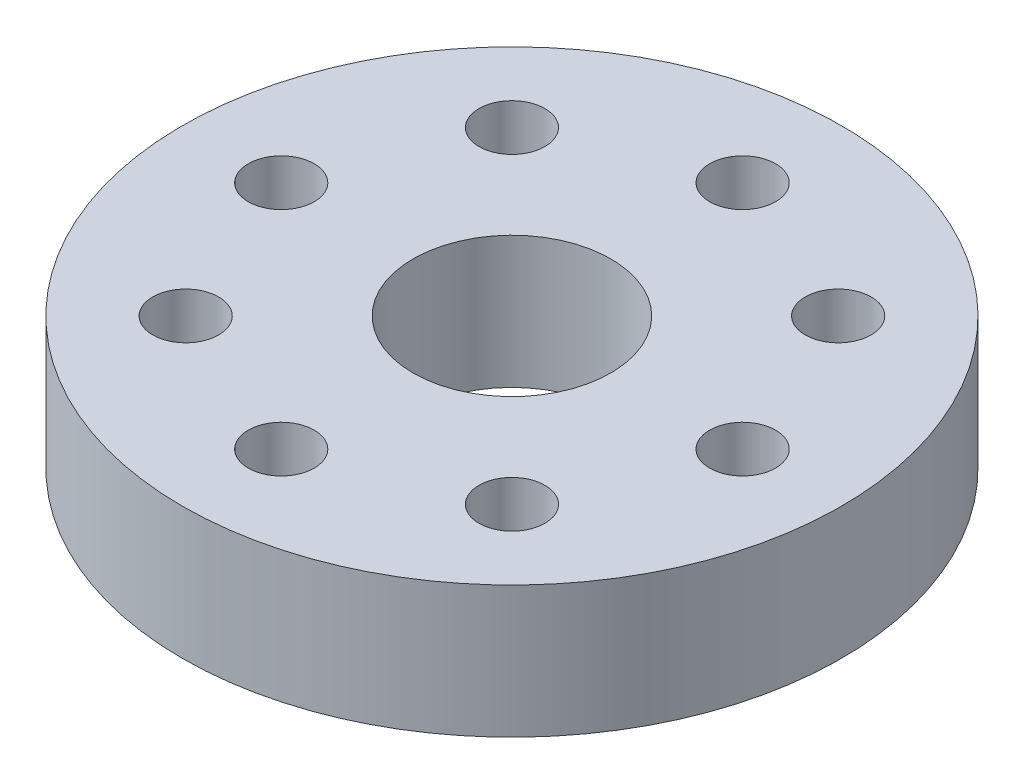
ISO-10303-21;
HEADER;
FILE_DESCRIPTION(('STEP AP214'),'2;1');
FILE_NAME('part.step','',(''),(''),'','','');
FILE_SCHEMA(('AUTOMOTIVE_DESIGN { 1 0 10303 214 1 1 1 1 }'));
ENDSEC;
DATA;
#1=APPLICATION_CONTEXT('core data for automotive mechanical design processes');
#2=APPLICATION_PROTOCOL_DEFINITION('international standard','automotive_design',2000,#1);
#3=PRODUCT_CONTEXT('',#1,'mechanical');
#4=PRODUCT('Part','Part','',(#3));
#5=PRODUCT_RELATED_PRODUCT_CATEGORY('part','',(#4));
#6=PRODUCT_DEFINITION_FORMATION('','',#4);
#7=PRODUCT_DEFINITION_CONTEXT('part definition',#1,'design');
#8=PRODUCT_DEFINITION('design','',#6,#7);
#9=PRODUCT_DEFINITION_SHAPE('','',#8);
#10=(LENGTH_UNIT() NAMED_UNIT(*) SI_UNIT(.MILLI.,.METRE.));
#11=(NAMED_UNIT(*) PLANE_ANGLE_UNIT() SI_UNIT($,.RADIAN.));
#12=(NAMED_UNIT(*) SI_UNIT($,.STERADIAN.) SOLID_ANGLE_UNIT());
#13=UNCERTAINTY_MEASURE_WITH_UNIT(LENGTH_MEASURE(1.E-05),#10,'distance_accuracy_value','');
#14=(GEOMETRIC_REPRESENTATION_CONTEXT(3) GLOBAL_UNCERTAINTY_ASSIGNED_CONTEXT((#13)) GLOBAL_UNIT_ASSIGNED_CONTEXT((#10,
#11,#12)) REPRESENTATION_CONTEXT('',''));
#15=CARTESIAN_POINT('',(0.,0.,0.));
#16=DIRECTION('',(0.,0.,1.));
#17=DIRECTION('',(1.,0.,0.));
#18=AXIS2_PLACEMENT_3D('',#15,#16,#17);
#19=CARTESIAN_POINT('',(0.,4.,0.));
#20=DIRECTION('',(0.,1.,0.));
#21=DIRECTION('',(0.,0.,1.));
#22=AXIS2_PLACEMENT_3D('',#19,#20,#21);
#23=PLANE('',#22);
#24=CARTESIAN_POINT('',(-7.,4.,0.));
#25=DIRECTION('',(0.,1.,0.));
#26=DIRECTION('',(0.,0.,1.));
#27=AXIS2_PLACEMENT_3D('',#24,#25,#26);
#28=CIRCLE('',#27,1.00000000000039);
#29=CARTESIAN_POINT('',(-7.,4.,1.0000000000004));
#30=VERTEX_POINT('',#29);
#31=EDGE_CURVE('E86',#30,#30,#28,.T.);
#32=ORIENTED_EDGE('',*,*,#31,.F.);
#33=EDGE_LOOP('',(#32));
#34=FACE_BOUND('',#33,.T.);
#35=CARTESIAN_POINT('',(0.,4.,7.));
#36=DIRECTION('',(0.,1.,0.));
#37=DIRECTION('',(0.,0.,1.));
#38=AXIS2_PLACEMENT_3D('',#35,#36,#37);
#39=CIRCLE('',#38,1.00000000000114);
#40=CARTESIAN_POINT('',(0.,4.,8.00000000000114));
#41=VERTEX_POINT('',#40);
#42=EDGE_CURVE('E74',#41,#41,#39,.T.);
#43=ORIENTED_EDGE('',*,*,#42,.F.);
#44=EDGE_LOOP('',(#43));
#45=FACE_BOUND('',#44,.T.);
#46=CARTESIAN_POINT('',(7.,4.,0.));
#47=DIRECTION('',(0.,1.,0.));
#48=DIRECTION('',(0.,0.,1.));
#49=AXIS2_PLACEMENT_3D('',#46,#47,#48);
#50=CIRCLE('',#49,1.00000000000074);
#51=CARTESIAN_POINT('',(7.,4.,1.00000000000074));
#52=VERTEX_POINT('',#51);
#53=EDGE_CURVE('E62',#52,#52,#50,.T.);
#54=ORIENTED_EDGE('',*,*,#53,.F.);
#55=EDGE_LOOP('',(#54));
#56=FACE_BOUND('',#55,.T.);
#57=CARTESIAN_POINT('',(0.,4.,-7.));
#58=DIRECTION('',(0.,1.,0.));
#59=DIRECTION('',(0.,0.,1.));
#60=AXIS2_PLACEMENT_3D('',#57,#58,#59);
#61=CIRCLE('',#60,1.);
#62=CARTESIAN_POINT('',(0.,4.,-6.));
#63=VERTEX_POINT('',#62);
#64=EDGE_CURVE('E50',#63,#63,#61,.T.);
#65=ORIENTED_EDGE('',*,*,#64,.F.);
#66=EDGE_LOOP('',(#65));
#67=FACE_BOUND('',#66,.T.);
#68=CARTESIAN_POINT('',(0.,4.,0.));
#69=DIRECTION('',(0.,1.,0.));
#70=DIRECTION('',(0.,0.,1.));
#71=AXIS2_PLACEMENT_3D('',#68,#69,#70);
#72=CIRCLE('',#71,10.);
#73=CARTESIAN_POINT('',(0.,4.,10.));
#74=VERTEX_POINT('',#73);
#75=EDGE_CURVE('E10',#74,#74,#72,.T.);
#76=ORIENTED_EDGE('',*,*,#75,.T.);
#77=EDGE_LOOP('',(#76));
#78=FACE_BOUND('',#77,.T.);
#79=CARTESIAN_POINT('',(0.,4.,0.));
#80=DIRECTION('',(0.,1.,0.));
#81=DIRECTION('',(0.,0.,1.));
#82=AXIS2_PLACEMENT_3D('',#79,#80,#81);
#83=CIRCLE('',#82,3.);
#84=CARTESIAN_POINT('',(0.,4.,3.));
#85=VERTEX_POINT('',#84);
#86=EDGE_CURVE('E45',#85,#85,#83,.T.);
#87=ORIENTED_EDGE('',*,*,#86,.F.);
#88=EDGE_LOOP('',(#87));
#89=FACE_BOUND('',#88,.T.);
#90=CARTESIAN_POINT('',(4.94974746830583,4.,-4.94974746830583));
#91=DIRECTION('',(0.,1.,0.));
#92=DIRECTION('',(0.,0.,1.));
#93=AXIS2_PLACEMENT_3D('',#90,#91,#92);
#94=CIRCLE('',#93,1.00000000000029);
#95=CARTESIAN_POINT('',(4.94974746830583,4.,-3.94974746830554));
#96=VERTEX_POINT('',#95);
#97=EDGE_CURVE('E56',#96,#96,#94,.T.);
#98=ORIENTED_EDGE('',*,*,#97,.F.);
#99=EDGE_LOOP('',(#98));
#100=FACE_BOUND('',#99,.T.);
#101=CARTESIAN_POINT('',(4.94974746830583,4.,4.94974746830583));
#102=DIRECTION('',(0.,1.,0.));
#103=DIRECTION('',(0.,0.,1.));
#104=AXIS2_PLACEMENT_3D('',#101,#102,#103);
#105=CIRCLE('',#104,1.0000000000011);
#106=CARTESIAN_POINT('',(4.94974746830583,4.,5.94974746830693));
#107=VERTEX_POINT('',#106);
#108=EDGE_CURVE('E68',#107,#107,#105,.T.);
#109=ORIENTED_EDGE('',*,*,#108,.F.);
#110=EDGE_LOOP('',(#109));
#111=FACE_BOUND('',#110,.T.);
#112=CARTESIAN_POINT('',(-4.94974746830583,4.,4.94974746830583));
#113=DIRECTION('',(0.,1.,0.));
#114=DIRECTION('',(0.,0.,1.));
#115=AXIS2_PLACEMENT_3D('',#112,#113,#114);
#116=CIRCLE('',#115,1.00000000000085);
#117=CARTESIAN_POINT('',(-4.94974746830583,4.,5.94974746830668));
#118=VERTEX_POINT('',#117);
#119=EDGE_CURVE('E80',#118,#118,#116,.T.);
#120=ORIENTED_EDGE('',*,*,#119,.F.);
#121=EDGE_LOOP('',(#120));
#122=FACE_BOUND('',#121,.T.);
#123=CARTESIAN_POINT('',(-4.94974746830583,4.,-4.94974746830583));
#124=DIRECTION('',(0.,1.,0.));
#125=DIRECTION('',(0.,0.,1.));
#126=AXIS2_PLACEMENT_3D('',#123,#124,#125);
#127=CIRCLE('',#126,1.00000000000004);
#128=CARTESIAN_POINT('',(-4.94974746830583,4.,-3.94974746830579));
#129=VERTEX_POINT('',#128);
#130=EDGE_CURVE('E92',#129,#129,#127,.T.);
#131=ORIENTED_EDGE('',*,*,#130,.F.);
#132=EDGE_LOOP('',(#131));
#133=FACE_BOUND('',#132,.T.);
#134=ADVANCED_FACE('F34',(#34,#45,#56,#67,#78,#89,#100,#111,#122,#133),#23,.T.);
#135=CARTESIAN_POINT('',(0.,0.,0.));
#136=DIRECTION('',(0.,1.,0.));
#137=DIRECTION('',(0.,0.,1.));
#138=AXIS2_PLACEMENT_3D('',#135,#136,#137);
#139=PLANE('',#138);
#140=CARTESIAN_POINT('',(0.,0.,0.));
#141=DIRECTION('',(0.,1.,0.));
#142=DIRECTION('',(0.,0.,1.));
#143=AXIS2_PLACEMENT_3D('',#140,#141,#142);
#144=CIRCLE('',#143,10.);
#145=CARTESIAN_POINT('',(0.,0.,10.));
#146=VERTEX_POINT('',#145);
#147=EDGE_CURVE('E38',#146,#146,#144,.T.);
#148=ORIENTED_EDGE('',*,*,#147,.F.);
#149=EDGE_LOOP('',(#148));
#150=FACE_BOUND('',#149,.T.);
#151=CARTESIAN_POINT('',(0.,0.,0.));
#152=DIRECTION('',(0.,1.,0.));
#153=DIRECTION('',(0.,0.,1.));
#154=AXIS2_PLACEMENT_3D('',#151,#152,#153);
#155=CIRCLE('',#154,3.);
#156=CARTESIAN_POINT('',(0.,0.,3.));
#157=VERTEX_POINT('',#156);
#158=EDGE_CURVE('E47',#157,#157,#155,.T.);
#159=ORIENTED_EDGE('',*,*,#158,.T.);
#160=EDGE_LOOP('',(#159));
#161=FACE_BOUND('',#160,.T.);
#162=CARTESIAN_POINT('',(0.,0.,-7.));
#163=DIRECTION('',(0.,1.,0.));
#164=DIRECTION('',(0.,0.,1.));
#165=AXIS2_PLACEMENT_3D('',#162,#163,#164);
#166=CIRCLE('',#165,1.);
#167=CARTESIAN_POINT('',(0.,0.,-6.));
#168=VERTEX_POINT('',#167);
#169=EDGE_CURVE('E53',#168,#168,#166,.T.);
#170=ORIENTED_EDGE('',*,*,#169,.T.);
#171=EDGE_LOOP('',(#170));
#172=FACE_BOUND('',#171,.T.);
#173=CARTESIAN_POINT('',(4.94974746830583,0.,-4.94974746830583));
#174=DIRECTION('',(0.,1.,0.));
#175=DIRECTION('',(0.,0.,1.));
#176=AXIS2_PLACEMENT_3D('',#173,#174,#175);
#177=CIRCLE('',#176,1.00000000000029);
#178=CARTESIAN_POINT('',(4.94974746830583,0.,-3.94974746830554));
#179=VERTEX_POINT('',#178);
#180=EDGE_CURVE('E59',#179,#179,#177,.T.);
#181=ORIENTED_EDGE('',*,*,#180,.T.);
#182=EDGE_LOOP('',(#181));
#183=FACE_BOUND('',#182,.T.);
#184=CARTESIAN_POINT('',(7.,0.,0.));
#185=DIRECTION('',(0.,1.,0.));
#186=DIRECTION('',(0.,0.,1.));
#187=AXIS2_PLACEMENT_3D('',#184,#185,#186);
#188=CIRCLE('',#187,1.00000000000074);
#189=CARTESIAN_POINT('',(7.,0.,1.00000000000074));
#190=VERTEX_POINT('',#189);
#191=EDGE_CURVE('E65',#190,#190,#188,.T.);
#192=ORIENTED_EDGE('',*,*,#191,.T.);
#193=EDGE_LOOP('',(#192));
#194=FACE_BOUND('',#193,.T.);
#195=CARTESIAN_POINT('',(4.94974746830583,0.,4.94974746830583));
#196=DIRECTION('',(0.,1.,0.));
#197=DIRECTION('',(0.,0.,1.));
#198=AXIS2_PLACEMENT_3D('',#195,#196,#197);
#199=CIRCLE('',#198,1.0000000000011);
#200=CARTESIAN_POINT('',(4.94974746830583,0.,5.94974746830693));
#201=VERTEX_POINT('',#200);
#202=EDGE_CURVE('E71',#201,#201,#199,.T.);
#203=ORIENTED_EDGE('',*,*,#202,.T.);
#204=EDGE_LOOP('',(#203));
#205=FACE_BOUND('',#204,.T.);
#206=CARTESIAN_POINT('',(0.,0.,7.));
#207=DIRECTION('',(0.,1.,0.));
#208=DIRECTION('',(0.,0.,1.));
#209=AXIS2_PLACEMENT_3D('',#206,#207,#208);
#210=CIRCLE('',#209,1.00000000000114);
#211=CARTESIAN_POINT('',(0.,0.,8.00000000000114));
#212=VERTEX_POINT('',#211);
#213=EDGE_CURVE('E77',#212,#212,#210,.T.);
#214=ORIENTED_EDGE('',*,*,#213,.T.);
#215=EDGE_LOOP('',(#214));
#216=FACE_BOUND('',#215,.T.);
#217=CARTESIAN_POINT('',(-4.94974746830583,0.,4.94974746830583));
#218=DIRECTION('',(0.,1.,0.));
#219=DIRECTION('',(0.,0.,1.));
#220=AXIS2_PLACEMENT_3D('',#217,#218,#219);
#221=CIRCLE('',#220,1.00000000000085);
#222=CARTESIAN_POINT('',(-4.94974746830583,0.,5.94974746830668));
#223=VERTEX_POINT('',#222);
#224=EDGE_CURVE('E83',#223,#223,#221,.T.);
#225=ORIENTED_EDGE('',*,*,#224,.T.);
#226=EDGE_LOOP('',(#225));
#227=FACE_BOUND('',#226,.T.);
#228=CARTESIAN_POINT('',(-7.,0.,0.));
#229=DIRECTION('',(0.,1.,0.));
#230=DIRECTION('',(0.,0.,1.));
#231=AXIS2_PLACEMENT_3D('',#228,#229,#230);
#232=CIRCLE('',#231,1.00000000000039);
#233=CARTESIAN_POINT('',(-7.,0.,1.0000000000004));
#234=VERTEX_POINT('',#233);
#235=EDGE_CURVE('E89',#234,#234,#232,.T.);
#236=ORIENTED_EDGE('',*,*,#235,.T.);
#237=EDGE_LOOP('',(#236));
#238=FACE_BOUND('',#237,.T.);
#239=CARTESIAN_POINT('',(-4.94974746830583,0.,-4.94974746830583));
#240=DIRECTION('',(0.,1.,0.));
#241=DIRECTION('',(0.,0.,1.));
#242=AXIS2_PLACEMENT_3D('',#239,#240,#241);
#243=CIRCLE('',#242,1.00000000000004);
#244=CARTESIAN_POINT('',(-4.94974746830583,0.,-3.94974746830579));
#245=VERTEX_POINT('',#244);
#246=EDGE_CURVE('E95',#245,#245,#243,.T.);
#247=ORIENTED_EDGE('',*,*,#246,.T.);
#248=EDGE_LOOP('',(#247));
#249=FACE_BOUND('',#248,.T.);
#250=ADVANCED_FACE('F105',(#150,#161,#172,#183,#194,#205,#216,#227,#238,#249),#139,.F.);
#251=CARTESIAN_POINT('',(0.,4.,0.));
#252=DIRECTION('',(0.,-1.,0.));
#253=DIRECTION('',(0.,0.,-1.));
#254=AXIS2_PLACEMENT_3D('',#251,#252,#253);
#255=CYLINDRICAL_SURFACE('',#254,10.);
#256=ORIENTED_EDGE('',*,*,#75,.F.);
#257=EDGE_LOOP('',(#256));
#258=FACE_BOUND('',#257,.T.);
#259=ORIENTED_EDGE('',*,*,#147,.T.);
#260=EDGE_LOOP('',(#259));
#261=FACE_BOUND('',#260,.T.);
#262=ADVANCED_FACE('F36',(#258,#261),#255,.T.);
#263=CARTESIAN_POINT('',(0.,4.,0.));
#264=DIRECTION('',(0.,-1.,0.));
#265=DIRECTION('',(0.,0.,-1.));
#266=AXIS2_PLACEMENT_3D('',#263,#264,#265);
#267=CYLINDRICAL_SURFACE('',#266,3.);
#268=ORIENTED_EDGE('',*,*,#86,.T.);
#269=EDGE_LOOP('',(#268));
#270=FACE_BOUND('',#269,.T.);
#271=ORIENTED_EDGE('',*,*,#158,.F.);
#272=EDGE_LOOP('',(#271));
#273=FACE_BOUND('',#272,.T.);
#274=ADVANCED_FACE('F115',(#270,#273),#267,.F.);
#275=CARTESIAN_POINT('',(0.,4.,-7.));
#276=DIRECTION('',(0.,-1.,0.));
#277=DIRECTION('',(0.,0.,-1.));
#278=AXIS2_PLACEMENT_3D('',#275,#276,#277);
#279=CYLINDRICAL_SURFACE('',#278,1.);
#280=ORIENTED_EDGE('',*,*,#64,.T.);
#281=EDGE_LOOP('',(#280));
#282=FACE_BOUND('',#281,.T.);
#283=ORIENTED_EDGE('',*,*,#169,.F.);
#284=EDGE_LOOP('',(#283));
#285=FACE_BOUND('',#284,.T.);
#286=ADVANCED_FACE('F118',(#282,#285),#279,.F.);
#287=CARTESIAN_POINT('',(4.94974746830583,4.,-4.94974746830583));
#288=DIRECTION('',(0.,-1.,0.));
#289=DIRECTION('',(0.,0.,-1.));
#290=AXIS2_PLACEMENT_3D('',#287,#288,#289);
#291=CYLINDRICAL_SURFACE('',#290,1.00000000000029);
#292=ORIENTED_EDGE('',*,*,#97,.T.);
#293=EDGE_LOOP('',(#292));
#294=FACE_BOUND('',#293,.T.);
#295=ORIENTED_EDGE('',*,*,#180,.F.);
#296=EDGE_LOOP('',(#295));
#297=FACE_BOUND('',#296,.T.);
#298=ADVANCED_FACE('F122',(#294,#297),#291,.F.);
#299=CARTESIAN_POINT('',(7.,4.,0.));
#300=DIRECTION('',(0.,-1.,0.));
#301=DIRECTION('',(0.,0.,-1.));
#302=AXIS2_PLACEMENT_3D('',#299,#300,#301);
#303=CYLINDRICAL_SURFACE('',#302,1.00000000000074);
#304=ORIENTED_EDGE('',*,*,#53,.T.);
#305=EDGE_LOOP('',(#304));
#306=FACE_BOUND('',#305,.T.);
#307=ORIENTED_EDGE('',*,*,#191,.F.);
#308=EDGE_LOOP('',(#307));
#309=FACE_BOUND('',#308,.T.);
#310=ADVANCED_FACE('F126',(#306,#309),#303,.F.);
#311=CARTESIAN_POINT('',(4.94974746830583,4.,4.94974746830583));
#312=DIRECTION('',(0.,-1.,0.));
#313=DIRECTION('',(0.,0.,-1.));
#314=AXIS2_PLACEMENT_3D('',#311,#312,#313);
#315=CYLINDRICAL_SURFACE('',#314,1.0000000000011);
#316=ORIENTED_EDGE('',*,*,#108,.T.);
#317=EDGE_LOOP('',(#316));
#318=FACE_BOUND('',#317,.T.);
#319=ORIENTED_EDGE('',*,*,#202,.F.);
#320=EDGE_LOOP('',(#319));
#321=FACE_BOUND('',#320,.T.);
#322=ADVANCED_FACE('F130',(#318,#321),#315,.F.);
#323=CARTESIAN_POINT('',(0.,4.,7.));
#324=DIRECTION('',(0.,-1.,0.));
#325=DIRECTION('',(0.,0.,-1.));
#326=AXIS2_PLACEMENT_3D('',#323,#324,#325);
#327=CYLINDRICAL_SURFACE('',#326,1.00000000000114);
#328=ORIENTED_EDGE('',*,*,#42,.T.);
#329=EDGE_LOOP('',(#328));
#330=FACE_BOUND('',#329,.T.);
#331=ORIENTED_EDGE('',*,*,#213,.F.);
#332=EDGE_LOOP('',(#331));
#333=FACE_BOUND('',#332,.T.);
#334=ADVANCED_FACE('F134',(#330,#333),#327,.F.);
#335=CARTESIAN_POINT('',(-4.94974746830583,4.,4.94974746830583));
#336=DIRECTION('',(0.,-1.,0.));
#337=DIRECTION('',(0.,0.,-1.));
#338=AXIS2_PLACEMENT_3D('',#335,#336,#337);
#339=CYLINDRICAL_SURFACE('',#338,1.00000000000085);
#340=ORIENTED_EDGE('',*,*,#119,.T.);
#341=EDGE_LOOP('',(#340));
#342=FACE_BOUND('',#341,.T.);
#343=ORIENTED_EDGE('',*,*,#224,.F.);
#344=EDGE_LOOP('',(#343));
#345=FACE_BOUND('',#344,.T.);
#346=ADVANCED_FACE('F138',(#342,#345),#339,.F.);
#347=CARTESIAN_POINT('',(-7.,4.,0.));
#348=DIRECTION('',(0.,-1.,0.));
#349=DIRECTION('',(0.,0.,-1.));
#350=AXIS2_PLACEMENT_3D('',#347,#348,#349);
#351=CYLINDRICAL_SURFACE('',#350,1.00000000000039);
#352=ORIENTED_EDGE('',*,*,#31,.T.);
#353=EDGE_LOOP('',(#352));
#354=FACE_BOUND('',#353,.T.);
#355=ORIENTED_EDGE('',*,*,#235,.F.);
#356=EDGE_LOOP('',(#355));
#357=FACE_BOUND('',#356,.T.);
#358=ADVANCED_FACE('F142',(#354,#357),#351,.F.);
#359=CARTESIAN_POINT('',(-4.94974746830583,4.,-4.94974746830583));
#360=DIRECTION('',(0.,-1.,0.));
#361=DIRECTION('',(0.,0.,-1.));
#362=AXIS2_PLACEMENT_3D('',#359,#360,#361);
#363=CYLINDRICAL_SURFACE('',#362,1.00000000000004);
#364=ORIENTED_EDGE('',*,*,#130,.T.);
#365=EDGE_LOOP('',(#364));
#366=FACE_BOUND('',#365,.T.);
#367=ORIENTED_EDGE('',*,*,#246,.F.);
#368=EDGE_LOOP('',(#367));
#369=FACE_BOUND('',#368,.T.);
#370=ADVANCED_FACE('F101',(#366,#369),#363,.F.);
#371=CLOSED_SHELL('',(#134,#250,#262,#274,#286,#298,#310,#322,#334,#346,#358,#370));
#372=MANIFOLD_SOLID_BREP('B2',#371);
#373=ADVANCED_BREP_SHAPE_REPRESENTATION('',(#18,#372),#14);
#374=SHAPE_DEFINITION_REPRESENTATION(#9,#373);
ENDSEC;
END-ISO-10303-21;
